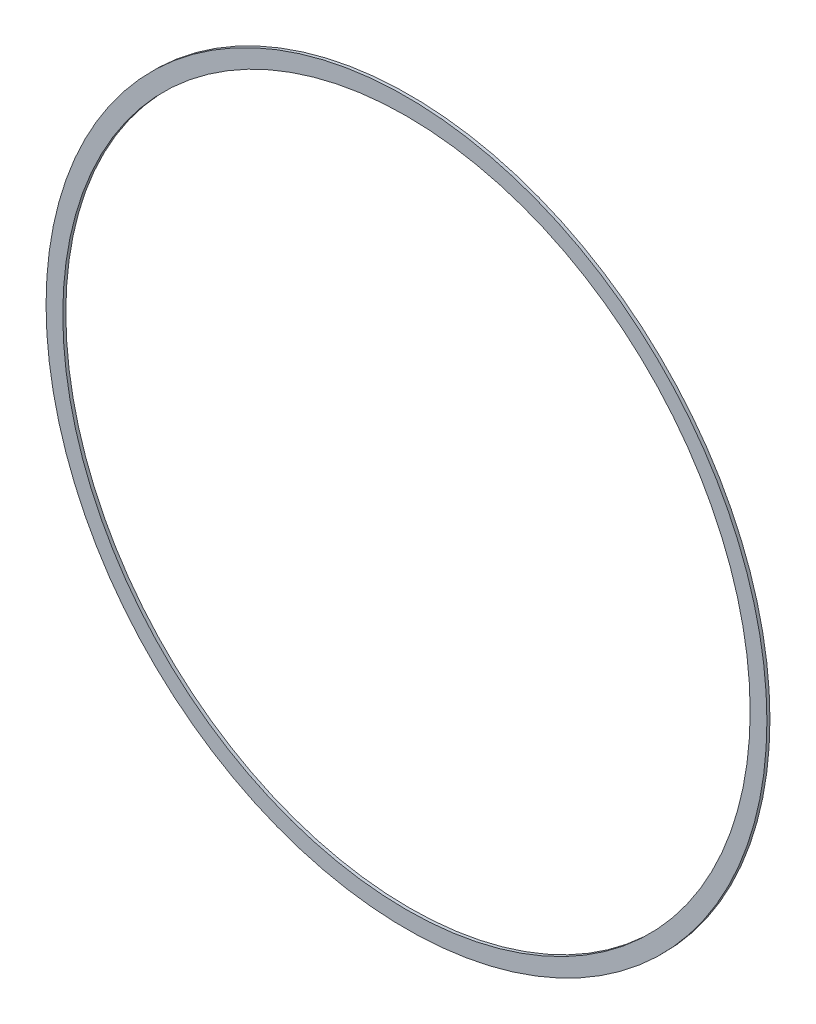
ISO-10303-21;
HEADER;
FILE_DESCRIPTION(('STEP AP214'),'2;1');
FILE_NAME('part.step','',(''),(''),'','','');
FILE_SCHEMA(('AUTOMOTIVE_DESIGN { 1 0 10303 214 1 1 1 1 }'));
ENDSEC;
DATA;
#1=APPLICATION_CONTEXT('core data for automotive mechanical design processes');
#2=APPLICATION_PROTOCOL_DEFINITION('international standard','automotive_design',2000,#1);
#3=PRODUCT_CONTEXT('',#1,'mechanical');
#4=PRODUCT('Part','Part','',(#3));
#5=PRODUCT_RELATED_PRODUCT_CATEGORY('part','',(#4));
#6=PRODUCT_DEFINITION_FORMATION('','',#4);
#7=PRODUCT_DEFINITION_CONTEXT('part definition',#1,'design');
#8=PRODUCT_DEFINITION('design','',#6,#7);
#9=PRODUCT_DEFINITION_SHAPE('','',#8);
#10=(LENGTH_UNIT() NAMED_UNIT(*) SI_UNIT(.MILLI.,.METRE.));
#11=(NAMED_UNIT(*) PLANE_ANGLE_UNIT() SI_UNIT($,.RADIAN.));
#12=(NAMED_UNIT(*) SI_UNIT($,.STERADIAN.) SOLID_ANGLE_UNIT());
#13=UNCERTAINTY_MEASURE_WITH_UNIT(LENGTH_MEASURE(1.E-05),#10,'distance_accuracy_value','');
#14=(GEOMETRIC_REPRESENTATION_CONTEXT(3) GLOBAL_UNCERTAINTY_ASSIGNED_CONTEXT((#13)) GLOBAL_UNIT_ASSIGNED_CONTEXT((#10,
#11,#12)) REPRESENTATION_CONTEXT('',''));
#15=CARTESIAN_POINT('',(0.,0.,0.));
#16=DIRECTION('',(0.,0.,1.));
#17=DIRECTION('',(1.,0.,0.));
#18=AXIS2_PLACEMENT_3D('',#15,#16,#17);
#19=CARTESIAN_POINT('',(0.,0.,2.));
#20=DIRECTION('',(0.,0.,1.));
#21=DIRECTION('',(1.,0.,0.));
#22=AXIS2_PLACEMENT_3D('',#19,#20,#21);
#23=PLANE('',#22);
#24=CARTESIAN_POINT('',(0.,0.,2.));
#25=DIRECTION('',(0.,0.,1.));
#26=DIRECTION('',(1.,0.,0.));
#27=AXIS2_PLACEMENT_3D('',#24,#25,#26);
#28=CIRCLE('',#27,237.);
#29=CARTESIAN_POINT('',(237.,0.,2.));
#30=VERTEX_POINT('',#29);
#31=EDGE_CURVE('E11',#30,#30,#28,.T.);
#32=ORIENTED_EDGE('',*,*,#31,.T.);
#33=EDGE_LOOP('',(#32));
#34=FACE_BOUND('',#33,.T.);
#35=CARTESIAN_POINT('',(0.,0.,2.));
#36=DIRECTION('',(0.,0.,1.));
#37=DIRECTION('',(1.,0.,0.));
#38=AXIS2_PLACEMENT_3D('',#35,#36,#37);
#39=CIRCLE('',#38,226.);
#40=CARTESIAN_POINT('',(226.,0.,2.));
#41=VERTEX_POINT('',#40);
#42=EDGE_CURVE('E53',#41,#41,#39,.T.);
#43=ORIENTED_EDGE('',*,*,#42,.F.);
#44=EDGE_LOOP('',(#43));
#45=FACE_BOUND('',#44,.T.);
#46=ADVANCED_FACE('F39',(#34,#45),#23,.T.);
#47=CARTESIAN_POINT('',(0.,0.,0.));
#48=DIRECTION('',(0.,0.,1.));
#49=DIRECTION('',(1.,0.,0.));
#50=AXIS2_PLACEMENT_3D('',#47,#48,#49);
#51=PLANE('',#50);
#52=CARTESIAN_POINT('',(0.,0.,0.));
#53=DIRECTION('',(0.,0.,1.));
#54=DIRECTION('',(1.,0.,0.));
#55=AXIS2_PLACEMENT_3D('',#52,#53,#54);
#56=CIRCLE('',#55,237.);
#57=CARTESIAN_POINT('',(237.,0.,0.));
#58=VERTEX_POINT('',#57);
#59=EDGE_CURVE('E43',#58,#58,#56,.T.);
#60=ORIENTED_EDGE('',*,*,#59,.F.);
#61=EDGE_LOOP('',(#60));
#62=FACE_BOUND('',#61,.T.);
#63=CARTESIAN_POINT('',(0.,0.,0.));
#64=DIRECTION('',(0.,0.,1.));
#65=DIRECTION('',(1.,0.,0.));
#66=AXIS2_PLACEMENT_3D('',#63,#64,#65);
#67=CIRCLE('',#66,226.);
#68=CARTESIAN_POINT('',(226.,0.,0.));
#69=VERTEX_POINT('',#68);
#70=EDGE_CURVE('E55',#69,#69,#67,.T.);
#71=ORIENTED_EDGE('',*,*,#70,.T.);
#72=EDGE_LOOP('',(#71));
#73=FACE_BOUND('',#72,.T.);
#74=ADVANCED_FACE('F68',(#62,#73),#51,.F.);
#75=CARTESIAN_POINT('',(0.,0.,2.));
#76=DIRECTION('',(0.,0.,-1.));
#77=DIRECTION('',(-1.,0.,0.));
#78=AXIS2_PLACEMENT_3D('',#75,#76,#77);
#79=CYLINDRICAL_SURFACE('',#78,237.);
#80=ORIENTED_EDGE('',*,*,#31,.F.);
#81=EDGE_LOOP('',(#80));
#82=FACE_BOUND('',#81,.T.);
#83=ORIENTED_EDGE('',*,*,#59,.T.);
#84=EDGE_LOOP('',(#83));
#85=FACE_BOUND('',#84,.T.);
#86=ADVANCED_FACE('F41',(#82,#85),#79,.T.);
#87=CARTESIAN_POINT('',(0.,0.,2.));
#88=DIRECTION('',(0.,0.,-1.));
#89=DIRECTION('',(-1.,0.,0.));
#90=AXIS2_PLACEMENT_3D('',#87,#88,#89);
#91=CYLINDRICAL_SURFACE('',#90,226.);
#92=ORIENTED_EDGE('',*,*,#42,.T.);
#93=EDGE_LOOP('',(#92));
#94=FACE_BOUND('',#93,.T.);
#95=ORIENTED_EDGE('',*,*,#70,.F.);
#96=EDGE_LOOP('',(#95));
#97=FACE_BOUND('',#96,.T.);
#98=ADVANCED_FACE('F64',(#94,#97),#91,.F.);
#99=CLOSED_SHELL('',(#46,#74,#86,#98));
#100=MANIFOLD_SOLID_BREP('B2',#99);
#101=ADVANCED_BREP_SHAPE_REPRESENTATION('',(#18,#100),#14);
#102=SHAPE_DEFINITION_REPRESENTATION(#9,#101);
ENDSEC;
END-ISO-10303-21;
